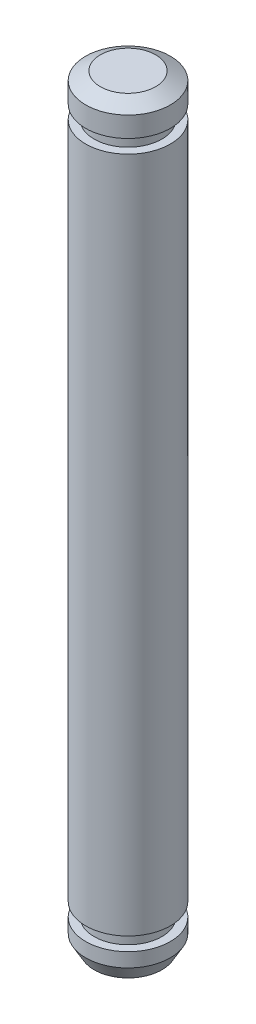
ISO-10303-21;
HEADER;
FILE_DESCRIPTION(('STEP AP214'),'2;1');
FILE_NAME('part.step','',(''),(''),'','','');
FILE_SCHEMA(('AUTOMOTIVE_DESIGN { 1 0 10303 214 1 1 1 1 }'));
ENDSEC;
DATA;
#1=APPLICATION_CONTEXT('core data for automotive mechanical design processes');
#2=APPLICATION_PROTOCOL_DEFINITION('international standard','automotive_design',2000,#1);
#3=PRODUCT_CONTEXT('',#1,'mechanical');
#4=PRODUCT('Part','Part','',(#3));
#5=PRODUCT_RELATED_PRODUCT_CATEGORY('part','',(#4));
#6=PRODUCT_DEFINITION_FORMATION('','',#4);
#7=PRODUCT_DEFINITION_CONTEXT('part definition',#1,'design');
#8=PRODUCT_DEFINITION('design','',#6,#7);
#9=PRODUCT_DEFINITION_SHAPE('','',#8);
#10=(LENGTH_UNIT() NAMED_UNIT(*) SI_UNIT(.MILLI.,.METRE.));
#11=(NAMED_UNIT(*) PLANE_ANGLE_UNIT() SI_UNIT($,.RADIAN.));
#12=(NAMED_UNIT(*) SI_UNIT($,.STERADIAN.) SOLID_ANGLE_UNIT());
#13=UNCERTAINTY_MEASURE_WITH_UNIT(LENGTH_MEASURE(1.E-05),#10,'distance_accuracy_value','');
#14=(GEOMETRIC_REPRESENTATION_CONTEXT(3) GLOBAL_UNCERTAINTY_ASSIGNED_CONTEXT((#13)) GLOBAL_UNIT_ASSIGNED_CONTEXT((#10,
#11,#12)) REPRESENTATION_CONTEXT('',''));
#15=CARTESIAN_POINT('',(0.,0.,0.));
#16=DIRECTION('',(0.,0.,1.));
#17=DIRECTION('',(1.,0.,0.));
#18=AXIS2_PLACEMENT_3D('',#15,#16,#17);
#19=CARTESIAN_POINT('',(0.,22.5,0.));
#20=DIRECTION('',(0.,-1.,0.));
#21=DIRECTION('',(0.,0.,-1.));
#22=AXIS2_PLACEMENT_3D('',#19,#20,#21);
#23=CYLINDRICAL_SURFACE('',#22,2.5);
#24=CARTESIAN_POINT('',(0.,20.,0.));
#25=DIRECTION('',(0.,1.,0.));
#26=DIRECTION('',(0.,0.,1.));
#27=AXIS2_PLACEMENT_3D('',#24,#25,#26);
#28=CIRCLE('',#27,2.5);
#29=CARTESIAN_POINT('',(0.,20.,-2.5));
#30=VERTEX_POINT('',#29);
#31=EDGE_CURVE('E61',#30,#30,#28,.T.);
#32=CARTESIAN_POINT('',(0.,-20.,0.));
#33=DIRECTION('',(0.,1.,0.));
#34=DIRECTION('',(0.,0.,1.));
#35=AXIS2_PLACEMENT_3D('',#32,#33,#34);
#36=CIRCLE('',#35,2.5);
#37=CARTESIAN_POINT('',(0.,-20.,-2.5));
#38=VERTEX_POINT('',#37);
#39=EDGE_CURVE('E73',#38,#38,#36,.T.);
#40=CARTESIAN_POINT('',(0.,20.,-2.5));
#41=CARTESIAN_POINT('',(0.,19.5833333333333,-2.5));
#42=CARTESIAN_POINT('',(0.,19.1666666666667,-2.5));
#43=CARTESIAN_POINT('',(0.,18.3333333333333,-2.5));
#44=CARTESIAN_POINT('',(0.,17.9166666666667,-2.5));
#45=CARTESIAN_POINT('',(0.,17.0833333333333,-2.5));
#46=CARTESIAN_POINT('',(0.,16.6666666666667,-2.5));
#47=CARTESIAN_POINT('',(0.,15.8333333333333,-2.5));
#48=CARTESIAN_POINT('',(0.,15.4166666666667,-2.5));
#49=CARTESIAN_POINT('',(0.,14.5833333333333,-2.5));
#50=CARTESIAN_POINT('',(0.,14.1666666666667,-2.5));
#51=CARTESIAN_POINT('',(0.,13.3333333333333,-2.5));
#52=CARTESIAN_POINT('',(0.,12.9166666666667,-2.5));
#53=CARTESIAN_POINT('',(0.,12.0833333333333,-2.5));
#54=CARTESIAN_POINT('',(0.,11.6666666666667,-2.5));
#55=CARTESIAN_POINT('',(0.,10.8333333333333,-2.5));
#56=CARTESIAN_POINT('',(0.,10.4166666666667,-2.5));
#57=CARTESIAN_POINT('',(0.,9.58333333333333,-2.5));
#58=CARTESIAN_POINT('',(0.,9.16666666666666,-2.5));
#59=CARTESIAN_POINT('',(0.,8.33333333333333,-2.5));
#60=CARTESIAN_POINT('',(0.,7.91666666666666,-2.5));
#61=CARTESIAN_POINT('',(0.,7.08333333333333,-2.5));
#62=CARTESIAN_POINT('',(0.,6.66666666666667,-2.5));
#63=CARTESIAN_POINT('',(0.,5.83333333333334,-2.5));
#64=CARTESIAN_POINT('',(0.,5.41666666666667,-2.5));
#65=CARTESIAN_POINT('',(0.,4.58333333333333,-2.5));
#66=CARTESIAN_POINT('',(0.,4.16666666666667,-2.5));
#67=CARTESIAN_POINT('',(0.,3.33333333333333,-2.5));
#68=CARTESIAN_POINT('',(0.,2.91666666666667,-2.5));
#69=CARTESIAN_POINT('',(0.,2.08333333333333,-2.5));
#70=CARTESIAN_POINT('',(0.,1.66666666666666,-2.5));
#71=CARTESIAN_POINT('',(0.,0.833333333333331,-2.5));
#72=CARTESIAN_POINT('',(0.,0.416666666666664,-2.5));
#73=CARTESIAN_POINT('',(0.,-0.416666666666671,-2.5));
#74=CARTESIAN_POINT('',(0.,-0.833333333333338,-2.5));
#75=CARTESIAN_POINT('',(0.,-1.66666666666667,-2.5));
#76=CARTESIAN_POINT('',(0.,-2.08333333333334,-2.5));
#77=CARTESIAN_POINT('',(0.,-2.91666666666667,-2.5));
#78=CARTESIAN_POINT('',(0.,-3.33333333333334,-2.5));
#79=CARTESIAN_POINT('',(0.,-4.16666666666667,-2.5));
#80=CARTESIAN_POINT('',(0.,-4.58333333333333,-2.5));
#81=CARTESIAN_POINT('',(0.,-5.41666666666667,-2.5));
#82=CARTESIAN_POINT('',(0.,-5.83333333333334,-2.5));
#83=CARTESIAN_POINT('',(0.,-6.66666666666667,-2.5));
#84=CARTESIAN_POINT('',(0.,-7.08333333333334,-2.5));
#85=CARTESIAN_POINT('',(0.,-7.91666666666667,-2.5));
#86=CARTESIAN_POINT('',(0.,-8.33333333333334,-2.5));
#87=CARTESIAN_POINT('',(0.,-9.16666666666667,-2.5));
#88=CARTESIAN_POINT('',(0.,-9.58333333333333,-2.5));
#89=CARTESIAN_POINT('',(0.,-10.4166666666667,-2.5));
#90=CARTESIAN_POINT('',(0.,-10.8333333333333,-2.5));
#91=CARTESIAN_POINT('',(0.,-11.6666666666667,-2.5));
#92=CARTESIAN_POINT('',(0.,-12.0833333333333,-2.5));
#93=CARTESIAN_POINT('',(0.,-12.9166666666667,-2.5));
#94=CARTESIAN_POINT('',(0.,-13.3333333333333,-2.5));
#95=CARTESIAN_POINT('',(0.,-14.1666666666667,-2.5));
#96=CARTESIAN_POINT('',(0.,-14.5833333333333,-2.5));
#97=CARTESIAN_POINT('',(0.,-15.4166666666667,-2.5));
#98=CARTESIAN_POINT('',(0.,-15.8333333333333,-2.5));
#99=CARTESIAN_POINT('',(0.,-16.6666666666667,-2.5));
#100=CARTESIAN_POINT('',(0.,-17.0833333333333,-2.5));
#101=CARTESIAN_POINT('',(0.,-17.9166666666667,-2.5));
#102=CARTESIAN_POINT('',(0.,-18.3333333333333,-2.5));
#103=CARTESIAN_POINT('',(0.,-19.1666666666667,-2.5));
#104=CARTESIAN_POINT('',(0.,-19.5833333333333,-2.5));
#105=CARTESIAN_POINT('',(0.,-20.,-2.5));
#106=B_SPLINE_CURVE_WITH_KNOTS('',3,(#40,#41,#42,#43,#44,#45,#46,#47,#48,#49,#50,#51,#52,#53,
#54,#55,#56,#57,#58,#59,#60,#61,#62,#63,#64,#65,#66,#67,#68,#69,#70,#71,#72,#73,#74,#75,#76,#77,
#78,#79,#80,#81,#82,#83,#84,#85,#86,#87,#88,#89,#90,#91,#92,#93,#94,#95,#96,#97,#98,#99,#100,
#101,#102,#103,#104,#105),.UNSPECIFIED.,.F.,.F.,(4,2,2,2,2,2,2,2,2,2,2,2,2,2,2,2,2,2,2,2,2,2,2,
2,2,2,2,2,2,2,2,2,4),(0.,1.25,2.5,3.75,5.,6.25,7.5,8.75,10.,11.25,12.5,13.75,15.,16.25,17.5,
18.75,20.,21.25,22.5,23.75,25.,26.25,27.5,28.75,30.,31.25,32.5,33.75,35.,36.25,37.5,38.75,40.),.UNSPECIFIED.);
#107=EDGE_CURVE('BSEAM39',#30,#38,#106,.T.);
#108=ORIENTED_EDGE('',*,*,#31,.F.);
#109=ORIENTED_EDGE('',*,*,#39,.T.);
#110=ORIENTED_EDGE('',*,*,#107,.T.);
#111=ORIENTED_EDGE('',*,*,#107,.F.);
#112=EDGE_LOOP('',(#108,#110,#109,#111));
#113=FACE_BOUND('',#112,.T.);
#114=ADVANCED_FACE('F39',(#113),#23,.T.);
#115=CARTESIAN_POINT('',(0.,22.,0.));
#116=DIRECTION('',(0.,1.,0.));
#117=DIRECTION('',(0.,0.,1.));
#118=AXIS2_PLACEMENT_3D('',#115,#116,#117);
#119=CIRCLE('',#118,2.5);
#120=CARTESIAN_POINT('',(0.,22.,-2.5));
#121=VERTEX_POINT('',#120);
#122=EDGE_CURVE('E51',#121,#121,#119,.F.);
#123=CARTESIAN_POINT('',(0.,20.8,0.));
#124=DIRECTION('',(0.,1.,0.));
#125=DIRECTION('',(0.,0.,1.));
#126=AXIS2_PLACEMENT_3D('',#123,#124,#125);
#127=CIRCLE('',#126,2.5);
#128=CARTESIAN_POINT('',(0.,20.8,-2.5));
#129=VERTEX_POINT('',#128);
#130=EDGE_CURVE('E60',#129,#129,#127,.T.);
#131=CARTESIAN_POINT('',(0.,22.,-2.5));
#132=CARTESIAN_POINT('',(0.,21.9875,-2.5));
#133=CARTESIAN_POINT('',(0.,21.975,-2.5));
#134=CARTESIAN_POINT('',(0.,21.95,-2.5));
#135=CARTESIAN_POINT('',(0.,21.9375,-2.5));
#136=CARTESIAN_POINT('',(0.,21.9125,-2.5));
#137=CARTESIAN_POINT('',(0.,21.9,-2.5));
#138=CARTESIAN_POINT('',(0.,21.875,-2.5));
#139=CARTESIAN_POINT('',(0.,21.8625,-2.5));
#140=CARTESIAN_POINT('',(0.,21.8375,-2.5));
#141=CARTESIAN_POINT('',(0.,21.825,-2.5));
#142=CARTESIAN_POINT('',(0.,21.8,-2.5));
#143=CARTESIAN_POINT('',(0.,21.7875,-2.5));
#144=CARTESIAN_POINT('',(0.,21.7625,-2.5));
#145=CARTESIAN_POINT('',(0.,21.75,-2.5));
#146=CARTESIAN_POINT('',(0.,21.725,-2.5));
#147=CARTESIAN_POINT('',(0.,21.7125,-2.5));
#148=CARTESIAN_POINT('',(0.,21.6875,-2.5));
#149=CARTESIAN_POINT('',(0.,21.675,-2.5));
#150=CARTESIAN_POINT('',(0.,21.65,-2.5));
#151=CARTESIAN_POINT('',(0.,21.6375,-2.5));
#152=CARTESIAN_POINT('',(0.,21.6125,-2.5));
#153=CARTESIAN_POINT('',(0.,21.6,-2.5));
#154=CARTESIAN_POINT('',(0.,21.575,-2.5));
#155=CARTESIAN_POINT('',(0.,21.5625,-2.5));
#156=CARTESIAN_POINT('',(0.,21.5375,-2.5));
#157=CARTESIAN_POINT('',(0.,21.525,-2.5));
#158=CARTESIAN_POINT('',(0.,21.5,-2.5));
#159=CARTESIAN_POINT('',(0.,21.4875,-2.5));
#160=CARTESIAN_POINT('',(0.,21.4625,-2.5));
#161=CARTESIAN_POINT('',(0.,21.45,-2.5));
#162=CARTESIAN_POINT('',(0.,21.425,-2.5));
#163=CARTESIAN_POINT('',(0.,21.4125,-2.5));
#164=CARTESIAN_POINT('',(0.,21.3875,-2.5));
#165=CARTESIAN_POINT('',(0.,21.375,-2.5));
#166=CARTESIAN_POINT('',(0.,21.35,-2.5));
#167=CARTESIAN_POINT('',(0.,21.3375,-2.5));
#168=CARTESIAN_POINT('',(0.,21.3125,-2.5));
#169=CARTESIAN_POINT('',(0.,21.3,-2.5));
#170=CARTESIAN_POINT('',(0.,21.275,-2.5));
#171=CARTESIAN_POINT('',(0.,21.2625,-2.5));
#172=CARTESIAN_POINT('',(0.,21.2375,-2.5));
#173=CARTESIAN_POINT('',(0.,21.225,-2.5));
#174=CARTESIAN_POINT('',(0.,21.2,-2.5));
#175=CARTESIAN_POINT('',(0.,21.1875,-2.5));
#176=CARTESIAN_POINT('',(0.,21.1625,-2.5));
#177=CARTESIAN_POINT('',(0.,21.15,-2.5));
#178=CARTESIAN_POINT('',(0.,21.125,-2.5));
#179=CARTESIAN_POINT('',(0.,21.1125,-2.5));
#180=CARTESIAN_POINT('',(0.,21.0875,-2.5));
#181=CARTESIAN_POINT('',(0.,21.075,-2.5));
#182=CARTESIAN_POINT('',(0.,21.05,-2.5));
#183=CARTESIAN_POINT('',(0.,21.0375,-2.5));
#184=CARTESIAN_POINT('',(0.,21.0125,-2.5));
#185=CARTESIAN_POINT('',(0.,21.,-2.5));
#186=CARTESIAN_POINT('',(0.,20.975,-2.5));
#187=CARTESIAN_POINT('',(0.,20.9625,-2.5));
#188=CARTESIAN_POINT('',(0.,20.9375,-2.5));
#189=CARTESIAN_POINT('',(0.,20.925,-2.5));
#190=CARTESIAN_POINT('',(0.,20.9,-2.5));
#191=CARTESIAN_POINT('',(0.,20.8875,-2.5));
#192=CARTESIAN_POINT('',(0.,20.8625,-2.5));
#193=CARTESIAN_POINT('',(0.,20.85,-2.5));
#194=CARTESIAN_POINT('',(0.,20.825,-2.5));
#195=CARTESIAN_POINT('',(0.,20.8125,-2.5));
#196=CARTESIAN_POINT('',(0.,20.8,-2.5));
#197=B_SPLINE_CURVE_WITH_KNOTS('',3,(#131,#132,#133,#134,#135,#136,#137,#138,#139,#140,#141,
#142,#143,#144,#145,#146,#147,#148,#149,#150,#151,#152,#153,#154,#155,#156,#157,#158,#159,#160,
#161,#162,#163,#164,#165,#166,#167,#168,#169,#170,#171,#172,#173,#174,#175,#176,#177,#178,#179,
#180,#181,#182,#183,#184,#185,#186,#187,#188,#189,#190,#191,#192,#193,#194,#195,#196),
.UNSPECIFIED.,.F.,.F.,(4,2,2,2,2,2,2,2,2,2,2,2,2,2,2,2,2,2,2,2,2,2,2,2,2,2,2,2,2,2,2,2,4),(0.,
0.0374999999999993,0.0749999999999987,0.112499999999998,0.149999999999997,0.187499999999997,
0.225,0.262499999999999,0.299999999999998,0.337499999999998,0.374999999999997,0.4125,
0.449999999999999,0.487499999999998,0.524999999999998,0.562499999999997,0.6,0.637499999999999,
0.674999999999998,0.712499999999998,0.749999999999997,0.787499999999997,0.824999999999999,
0.862499999999999,0.899999999999998,0.937499999999997,0.974999999999997,1.0125,1.05,1.0875,
1.125,1.1625,1.2),.UNSPECIFIED.);
#198=EDGE_CURVE('BSEAM101',#121,#129,#197,.T.);
#199=ORIENTED_EDGE('',*,*,#122,.T.);
#200=ORIENTED_EDGE('',*,*,#130,.T.);
#201=ORIENTED_EDGE('',*,*,#198,.T.);
#202=ORIENTED_EDGE('',*,*,#198,.F.);
#203=EDGE_LOOP('',(#199,#201,#200,#202));
#204=FACE_BOUND('',#203,.T.);
#205=ADVANCED_FACE('F101',(#204),#23,.T.);
#206=CARTESIAN_POINT('',(0.,22.5,0.));
#207=DIRECTION('',(0.,1.,0.));
#208=DIRECTION('',(0.,0.,1.));
#209=AXIS2_PLACEMENT_3D('',#206,#207,#208);
#210=PLANE('',#209);
#211=CARTESIAN_POINT('',(0.,22.5,0.));
#212=DIRECTION('',(0.,1.,0.));
#213=DIRECTION('',(0.,0.,1.));
#214=AXIS2_PLACEMENT_3D('',#211,#212,#213);
#215=CIRCLE('',#214,1.63397459621557);
#216=CARTESIAN_POINT('',(0.,22.5,1.63397459621557));
#217=VERTEX_POINT('',#216);
#218=EDGE_CURVE('E55',#217,#217,#215,.T.);
#219=ORIENTED_EDGE('',*,*,#218,.T.);
#220=EDGE_LOOP('',(#219));
#221=FACE_BOUND('',#220,.T.);
#222=ADVANCED_FACE('F110',(#221),#210,.T.);
#223=CARTESIAN_POINT('',(0.,20.8,0.));
#224=DIRECTION('',(0.,1.,0.));
#225=DIRECTION('',(0.,0.,1.));
#226=AXIS2_PLACEMENT_3D('',#223,#224,#225);
#227=PLANE('',#226);
#228=ORIENTED_EDGE('',*,*,#130,.F.);
#229=EDGE_LOOP('',(#228));
#230=FACE_BOUND('',#229,.T.);
#231=CARTESIAN_POINT('',(0.,20.8,0.));
#232=DIRECTION('',(0.,1.,0.));
#233=DIRECTION('',(0.,0.,1.));
#234=AXIS2_PLACEMENT_3D('',#231,#232,#233);
#235=CIRCLE('',#234,2.);
#236=CARTESIAN_POINT('',(0.,20.8,2.));
#237=VERTEX_POINT('',#236);
#238=EDGE_CURVE('E64',#237,#237,#235,.T.);
#239=ORIENTED_EDGE('',*,*,#238,.T.);
#240=EDGE_LOOP('',(#239));
#241=FACE_BOUND('',#240,.T.);
#242=ADVANCED_FACE('F132',(#230,#241),#227,.F.);
#243=CARTESIAN_POINT('',(0.,20.,0.));
#244=DIRECTION('',(0.,1.,0.));
#245=DIRECTION('',(0.,0.,1.));
#246=AXIS2_PLACEMENT_3D('',#243,#244,#245);
#247=PLANE('',#246);
#248=ORIENTED_EDGE('',*,*,#31,.T.);
#249=EDGE_LOOP('',(#248));
#250=FACE_BOUND('',#249,.T.);
#251=CARTESIAN_POINT('',(0.,20.,0.));
#252=DIRECTION('',(0.,1.,0.));
#253=DIRECTION('',(0.,0.,1.));
#254=AXIS2_PLACEMENT_3D('',#251,#252,#253);
#255=CIRCLE('',#254,2.);
#256=CARTESIAN_POINT('',(0.,20.,2.));
#257=VERTEX_POINT('',#256);
#258=EDGE_CURVE('E67',#257,#257,#255,.T.);
#259=ORIENTED_EDGE('',*,*,#258,.F.);
#260=EDGE_LOOP('',(#259));
#261=FACE_BOUND('',#260,.T.);
#262=ADVANCED_FACE('F130',(#250,#261),#247,.T.);
#263=CARTESIAN_POINT('',(0.,20.8,0.));
#264=DIRECTION('',(0.,-1.,0.));
#265=DIRECTION('',(0.,0.,-1.));
#266=AXIS2_PLACEMENT_3D('',#263,#264,#265);
#267=CYLINDRICAL_SURFACE('',#266,2.);
#268=ORIENTED_EDGE('',*,*,#238,.F.);
#269=EDGE_LOOP('',(#268));
#270=FACE_BOUND('',#269,.T.);
#271=ORIENTED_EDGE('',*,*,#258,.T.);
#272=EDGE_LOOP('',(#271));
#273=FACE_BOUND('',#272,.T.);
#274=ADVANCED_FACE('F92',(#270,#273),#267,.T.);
#275=CARTESIAN_POINT('',(0.,-20.8,0.));
#276=DIRECTION('',(0.,-1.,0.));
#277=DIRECTION('',(0.,0.,1.));
#278=AXIS2_PLACEMENT_3D('',#275,#276,#277);
#279=PLANE('',#278);
#280=CARTESIAN_POINT('',(0.,-20.8,0.));
#281=DIRECTION('',(0.,1.,0.));
#282=DIRECTION('',(0.,0.,1.));
#283=AXIS2_PLACEMENT_3D('',#280,#281,#282);
#284=CIRCLE('',#283,2.);
#285=CARTESIAN_POINT('',(0.,-20.8,2.));
#286=VERTEX_POINT('',#285);
#287=EDGE_CURVE('E76',#286,#286,#284,.T.);
#288=ORIENTED_EDGE('',*,*,#287,.F.);
#289=EDGE_LOOP('',(#288));
#290=FACE_BOUND('',#289,.T.);
#291=CARTESIAN_POINT('',(0.,-20.8,0.));
#292=DIRECTION('',(0.,1.,0.));
#293=DIRECTION('',(0.,0.,1.));
#294=AXIS2_PLACEMENT_3D('',#291,#292,#293);
#295=CIRCLE('',#294,2.5);
#296=CARTESIAN_POINT('',(0.,-20.8,-2.5));
#297=VERTEX_POINT('',#296);
#298=EDGE_CURVE('E70',#297,#297,#295,.T.);
#299=ORIENTED_EDGE('',*,*,#298,.T.);
#300=EDGE_LOOP('',(#299));
#301=FACE_BOUND('',#300,.T.);
#302=ADVANCED_FACE('F88',(#290,#301),#279,.F.);
#303=CARTESIAN_POINT('',(0.,-20.,0.));
#304=DIRECTION('',(0.,-1.,0.));
#305=DIRECTION('',(0.,0.,1.));
#306=AXIS2_PLACEMENT_3D('',#303,#304,#305);
#307=PLANE('',#306);
#308=CARTESIAN_POINT('',(0.,-20.,0.));
#309=DIRECTION('',(0.,1.,0.));
#310=DIRECTION('',(0.,0.,1.));
#311=AXIS2_PLACEMENT_3D('',#308,#309,#310);
#312=CIRCLE('',#311,2.);
#313=CARTESIAN_POINT('',(0.,-20.,2.));
#314=VERTEX_POINT('',#313);
#315=EDGE_CURVE('E79',#314,#314,#312,.T.);
#316=ORIENTED_EDGE('',*,*,#315,.T.);
#317=EDGE_LOOP('',(#316));
#318=FACE_BOUND('',#317,.T.);
#319=ORIENTED_EDGE('',*,*,#39,.F.);
#320=EDGE_LOOP('',(#319));
#321=FACE_BOUND('',#320,.T.);
#322=ADVANCED_FACE('F91',(#318,#321),#307,.T.);
#323=CARTESIAN_POINT('',(0.,-20.8,0.));
#324=DIRECTION('',(0.,1.,0.));
#325=DIRECTION('',(0.,0.,1.));
#326=AXIS2_PLACEMENT_3D('',#323,#324,#325);
#327=CYLINDRICAL_SURFACE('',#326,2.);
#328=ORIENTED_EDGE('',*,*,#287,.T.);
#329=EDGE_LOOP('',(#328));
#330=FACE_BOUND('',#329,.T.);
#331=ORIENTED_EDGE('',*,*,#315,.F.);
#332=EDGE_LOOP('',(#331));
#333=FACE_BOUND('',#332,.T.);
#334=ADVANCED_FACE('F85',(#330,#333),#327,.T.);
#335=CARTESIAN_POINT('',(0.,-22.5,0.));
#336=DIRECTION('',(0.,-1.,0.));
#337=DIRECTION('',(0.,0.,1.));
#338=AXIS2_PLACEMENT_3D('',#335,#336,#337);
#339=PLANE('',#338);
#340=CARTESIAN_POINT('',(0.,-22.5,0.));
#341=DIRECTION('',(0.,-1.,0.));
#342=DIRECTION('',(0.,0.,-1.));
#343=AXIS2_PLACEMENT_3D('',#340,#341,#342);
#344=CIRCLE('',#343,1.99999999999992);
#345=CARTESIAN_POINT('',(0.,-22.5,-1.99999999999992));
#346=VERTEX_POINT('',#345);
#347=EDGE_CURVE('E10',#346,#346,#344,.T.);
#348=ORIENTED_EDGE('',*,*,#347,.T.);
#349=EDGE_LOOP('',(#348));
#350=FACE_BOUND('',#349,.T.);
#351=ADVANCED_FACE('F99',(#350),#339,.T.);
#352=CARTESIAN_POINT('',(0.,-21.6339745962154,0.));
#353=DIRECTION('',(0.,-1.,0.));
#354=DIRECTION('',(0.,0.,-1.));
#355=AXIS2_PLACEMENT_3D('',#352,#353,#354);
#356=CIRCLE('',#355,2.5);
#357=CARTESIAN_POINT('',(0.,-21.6339745962154,-2.5));
#358=VERTEX_POINT('',#357);
#359=EDGE_CURVE('E47',#358,#358,#356,.F.);
#360=CARTESIAN_POINT('',(0.,-21.6339745962154,-2.5));
#361=CARTESIAN_POINT('',(0.,-21.6252873608382,-2.5));
#362=CARTESIAN_POINT('',(0.,-21.616600125461,-2.5));
#363=CARTESIAN_POINT('',(0.,-21.5992256547065,-2.5));
#364=CARTESIAN_POINT('',(0.,-21.5905384193292,-2.5));
#365=CARTESIAN_POINT('',(0.,-21.5731639485747,-2.5));
#366=CARTESIAN_POINT('',(0.,-21.5644767131975,-2.5));
#367=CARTESIAN_POINT('',(0.,-21.547102242443,-2.5));
#368=CARTESIAN_POINT('',(0.,-21.5384150070658,-2.5));
#369=CARTESIAN_POINT('',(0.,-21.5210405363113,-2.5));
#370=CARTESIAN_POINT('',(0.,-21.512353300934,-2.5));
#371=CARTESIAN_POINT('',(0.,-21.4949788301795,-2.5));
#372=CARTESIAN_POINT('',(0.,-21.4862915948023,-2.5));
#373=CARTESIAN_POINT('',(0.,-21.4689171240478,-2.5));
#374=CARTESIAN_POINT('',(0.,-21.4602298886706,-2.5));
#375=CARTESIAN_POINT('',(0.,-21.4428554179161,-2.5));
#376=CARTESIAN_POINT('',(0.,-21.4341681825388,-2.5));
#377=CARTESIAN_POINT('',(0.,-21.4167937117843,-2.5));
#378=CARTESIAN_POINT('',(0.,-21.4081064764071,-2.5));
#379=CARTESIAN_POINT('',(0.,-21.3907320056526,-2.5));
#380=CARTESIAN_POINT('',(0.,-21.3820447702754,-2.5));
#381=CARTESIAN_POINT('',(0.,-21.3646702995209,-2.5));
#382=CARTESIAN_POINT('',(0.,-21.3559830641436,-2.5));
#383=CARTESIAN_POINT('',(0.,-21.3386085933891,-2.5));
#384=CARTESIAN_POINT('',(0.,-21.3299213580119,-2.5));
#385=CARTESIAN_POINT('',(0.,-21.3125468872574,-2.5));
#386=CARTESIAN_POINT('',(0.,-21.3038596518802,-2.5));
#387=CARTESIAN_POINT('',(0.,-21.2864851811257,-2.5));
#388=CARTESIAN_POINT('',(0.,-21.2777979457484,-2.5));
#389=CARTESIAN_POINT('',(0.,-21.2604234749939,-2.5));
#390=CARTESIAN_POINT('',(0.,-21.2517362396167,-2.5));
#391=CARTESIAN_POINT('',(0.,-21.2343617688622,-2.5));
#392=CARTESIAN_POINT('',(0.,-21.225674533485,-2.5));
#393=CARTESIAN_POINT('',(0.,-21.2083000627305,-2.5));
#394=CARTESIAN_POINT('',(0.,-21.1996128273532,-2.5));
#395=CARTESIAN_POINT('',(0.,-21.1822383565987,-2.5));
#396=CARTESIAN_POINT('',(0.,-21.1735511212215,-2.5));
#397=CARTESIAN_POINT('',(0.,-21.156176650467,-2.5));
#398=CARTESIAN_POINT('',(0.,-21.1474894150898,-2.5));
#399=CARTESIAN_POINT('',(0.,-21.1301149443353,-2.5));
#400=CARTESIAN_POINT('',(0.,-21.121427708958,-2.5));
#401=CARTESIAN_POINT('',(0.,-21.1040532382035,-2.5));
#402=CARTESIAN_POINT('',(0.,-21.0953660028263,-2.5));
#403=CARTESIAN_POINT('',(0.,-21.0779915320718,-2.5));
#404=CARTESIAN_POINT('',(0.,-21.0693042966946,-2.5));
#405=CARTESIAN_POINT('',(0.,-21.0519298259401,-2.5));
#406=CARTESIAN_POINT('',(0.,-21.0432425905628,-2.5));
#407=CARTESIAN_POINT('',(0.,-21.0258681198083,-2.5));
#408=CARTESIAN_POINT('',(0.,-21.0171808844311,-2.5));
#409=CARTESIAN_POINT('',(0.,-20.9998064136766,-2.5));
#410=CARTESIAN_POINT('',(0.,-20.9911191782994,-2.5));
#411=CARTESIAN_POINT('',(0.,-20.9737447075449,-2.5));
#412=CARTESIAN_POINT('',(0.,-20.9650574721676,-2.5));
#413=CARTESIAN_POINT('',(0.,-20.9476830014132,-2.5));
#414=CARTESIAN_POINT('',(0.,-20.9389957660359,-2.5));
#415=CARTESIAN_POINT('',(0.,-20.9216212952814,-2.5));
#416=CARTESIAN_POINT('',(0.,-20.9129340599042,-2.5));
#417=CARTESIAN_POINT('',(0.,-20.8955595891497,-2.5));
#418=CARTESIAN_POINT('',(0.,-20.8868723537724,-2.5));
#419=CARTESIAN_POINT('',(0.,-20.869497883018,-2.5));
#420=CARTESIAN_POINT('',(0.,-20.8608106476407,-2.5));
#421=CARTESIAN_POINT('',(0.,-20.8434361768862,-2.5));
#422=CARTESIAN_POINT('',(0.,-20.834748941509,-2.5));
#423=CARTESIAN_POINT('',(0.,-20.8173744707545,-2.5));
#424=CARTESIAN_POINT('',(0.,-20.8086872353772,-2.5));
#425=CARTESIAN_POINT('',(0.,-20.8,-2.5));
#426=B_SPLINE_CURVE_WITH_KNOTS('',3,(#360,#361,#362,#363,#364,#365,#366,#367,#368,#369,#370,
#371,#372,#373,#374,#375,#376,#377,#378,#379,#380,#381,#382,#383,#384,#385,#386,#387,#388,#389,
#390,#391,#392,#393,#394,#395,#396,#397,#398,#399,#400,#401,#402,#403,#404,#405,#406,#407,#408,
#409,#410,#411,#412,#413,#414,#415,#416,#417,#418,#419,#420,#421,#422,#423,#424,#425),
.UNSPECIFIED.,.F.,.F.,(4,2,2,2,2,2,2,2,2,2,2,2,2,2,2,2,2,2,2,2,2,2,2,2,2,2,2,2,2,2,2,2,4),(0.,
0.0260617061317303,0.0521234122634676,0.0781851183951979,0.104246824526928,0.130308530658665,
0.156370236790396,0.182431942922126,0.208493649053856,0.234555355185594,0.260617061317324,
0.286678767449054,0.312740473580791,0.338802179712522,0.364863885844252,0.390925591975989,
0.41698729810772,0.44304900423945,0.469110710371187,0.495172416502918,0.521234122634648,
0.547295828766385,0.573357534898115,0.599419241029846,0.625480947161583,0.651542653293313,
0.677604359425044,0.703666065556774,0.729727771688511,0.755789477820241,0.781851183951972,
0.807912890083709,0.833974596215439),.UNSPECIFIED.);
#427=EDGE_CURVE('BSEAM96',#358,#297,#426,.T.);
#428=ORIENTED_EDGE('',*,*,#359,.T.);
#429=ORIENTED_EDGE('',*,*,#298,.F.);
#430=ORIENTED_EDGE('',*,*,#427,.T.);
#431=ORIENTED_EDGE('',*,*,#427,.F.);
#432=EDGE_LOOP('',(#428,#430,#429,#431));
#433=FACE_BOUND('',#432,.T.);
#434=ADVANCED_FACE('F96',(#433),#23,.T.);
#435=CARTESIAN_POINT('',(0.,22.5,0.));
#436=DIRECTION('',(0.,-1.,0.));
#437=DIRECTION('',(0.,0.,-1.));
#438=AXIS2_PLACEMENT_3D('',#435,#436,#437);
#439=CONICAL_SURFACE('',#438,1.63397459621557,1.04719755119659);
#440=ORIENTED_EDGE('',*,*,#122,.F.);
#441=EDGE_LOOP('',(#440));
#442=FACE_BOUND('',#441,.T.);
#443=ORIENTED_EDGE('',*,*,#218,.F.);
#444=EDGE_LOOP('',(#443));
#445=FACE_BOUND('',#444,.T.);
#446=ADVANCED_FACE('F98',(#442,#445),#439,.T.);
#447=CARTESIAN_POINT('',(0.,-21.6339745962154,0.));
#448=DIRECTION('',(0.,1.,0.));
#449=DIRECTION('',(0.,0.,1.));
#450=AXIS2_PLACEMENT_3D('',#447,#448,#449);
#451=CONICAL_SURFACE('',#450,2.5,0.523598775598306);
#452=ORIENTED_EDGE('',*,*,#347,.F.);
#453=EDGE_LOOP('',(#452));
#454=FACE_BOUND('',#453,.T.);
#455=ORIENTED_EDGE('',*,*,#359,.F.);
#456=EDGE_LOOP('',(#455));
#457=FACE_BOUND('',#456,.T.);
#458=ADVANCED_FACE('F42',(#454,#457),#451,.T.);
#459=CLOSED_SHELL('',(#114,#205,#222,#242,#262,#274,#302,#322,#334,#351,#434,#446,#458));
#460=MANIFOLD_SOLID_BREP('B2',#459);
#461=ADVANCED_BREP_SHAPE_REPRESENTATION('',(#18,#460),#14);
#462=SHAPE_DEFINITION_REPRESENTATION(#9,#461);
ENDSEC;
END-ISO-10303-21;
